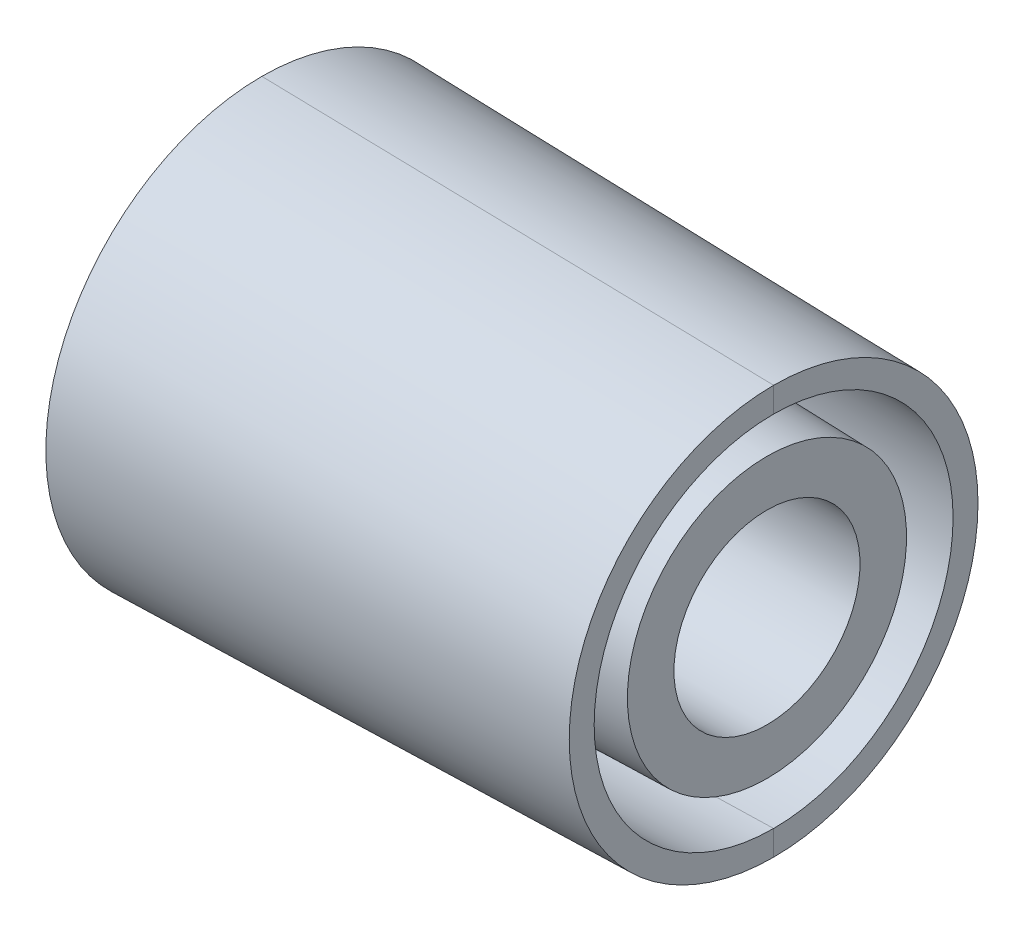
ISO-10303-21;
HEADER;
FILE_DESCRIPTION(('STEP AP214'),'2;1');
FILE_NAME('part.step','',(''),(''),'','','');
FILE_SCHEMA(('AUTOMOTIVE_DESIGN { 1 0 10303 214 1 1 1 1 }'));
ENDSEC;
DATA;
#1=APPLICATION_CONTEXT('core data for automotive mechanical design processes');
#2=APPLICATION_PROTOCOL_DEFINITION('international standard','automotive_design',2000,#1);
#3=PRODUCT_CONTEXT('',#1,'mechanical');
#4=PRODUCT('Part','Part','',(#3));
#5=PRODUCT_RELATED_PRODUCT_CATEGORY('part','',(#4));
#6=PRODUCT_DEFINITION_FORMATION('','',#4);
#7=PRODUCT_DEFINITION_CONTEXT('part definition',#1,'design');
#8=PRODUCT_DEFINITION('design','',#6,#7);
#9=PRODUCT_DEFINITION_SHAPE('','',#8);
#10=(LENGTH_UNIT() NAMED_UNIT(*) SI_UNIT(.MILLI.,.METRE.));
#11=(NAMED_UNIT(*) PLANE_ANGLE_UNIT() SI_UNIT($,.RADIAN.));
#12=(NAMED_UNIT(*) SI_UNIT($,.STERADIAN.) SOLID_ANGLE_UNIT());
#13=UNCERTAINTY_MEASURE_WITH_UNIT(LENGTH_MEASURE(1.E-05),#10,'distance_accuracy_value','');
#14=(GEOMETRIC_REPRESENTATION_CONTEXT(3) GLOBAL_UNCERTAINTY_ASSIGNED_CONTEXT((#13)) GLOBAL_UNIT_ASSIGNED_CONTEXT((#10,
#11,#12)) REPRESENTATION_CONTEXT('',''));
#15=CARTESIAN_POINT('',(0.,0.,0.));
#16=DIRECTION('',(0.,0.,1.));
#17=DIRECTION('',(1.,0.,0.));
#18=AXIS2_PLACEMENT_3D('',#15,#16,#17);
#19=CARTESIAN_POINT('',(3420.,0.,0.));
#20=DIRECTION('',(-1.,0.,0.));
#21=DIRECTION('',(0.,0.,1.));
#22=AXIS2_PLACEMENT_3D('',#19,#20,#21);
#23=CONICAL_SURFACE('',#22,540.,0.0259681872115557);
#24=CARTESIAN_POINT('',(1880.,0.,0.));
#25=DIRECTION('',(-1.,0.,0.));
#26=DIRECTION('',(0.,0.,1.));
#27=AXIS2_PLACEMENT_3D('',#24,#25,#26);
#28=CIRCLE('',#27,579.999999999999);
#29=CARTESIAN_POINT('',(1880.,579.999999999998,-3.10820800386331E-05));
#30=VERTEX_POINT('',#29);
#31=CARTESIAN_POINT('',(1880.,-579.999999999999,0.));
#32=VERTEX_POINT('',#31);
#33=EDGE_CURVE('E12',#30,#32,#28,.T.);
#34=ORIENTED_EDGE('',*,*,#33,.T.);
#35=DIRECTION('',(-0.999662845573694,-0.0259652687161992,0.));
#36=VECTOR('',#35,1.);
#37=CARTESIAN_POINT('',(3420.,-540.,0.));
#38=LINE('',#37,#36);
#39=CARTESIAN_POINT('',(3420.,-540.,0.));
#40=VERTEX_POINT('',#39);
#41=EDGE_CURVE('E89',#40,#32,#38,.T.);
#42=ORIENTED_EDGE('',*,*,#41,.F.);
#43=CARTESIAN_POINT('',(3420.,0.,0.));
#44=DIRECTION('',(-1.,0.,0.));
#45=DIRECTION('',(0.,0.,1.));
#46=AXIS2_PLACEMENT_3D('',#43,#44,#45);
#47=CIRCLE('',#46,540.);
#48=CARTESIAN_POINT('',(3420.,539.999999999999,-2.89384883118309E-05));
#49=VERTEX_POINT('',#48);
#50=EDGE_CURVE('E61',#49,#40,#47,.T.);
#51=ORIENTED_EDGE('',*,*,#50,.F.);
#52=DIRECTION('',(-0.999662845573694,0.0259652687161992,-1.39147338010607E-09));
#53=VECTOR('',#52,1.);
#54=CARTESIAN_POINT('',(3420.,539.999999999999,-2.89384883118309E-05));
#55=LINE('',#54,#53);
#56=EDGE_CURVE('E95',#49,#30,#55,.T.);
#57=ORIENTED_EDGE('',*,*,#56,.T.);
#58=EDGE_LOOP('',(#34,#42,#51,#57));
#59=FACE_BOUND('',#58,.T.);
#60=ADVANCED_FACE('F49',(#59),#23,.F.);
#61=CARTESIAN_POINT('',(1880.,579.999999999998,-3.10820800386331E-05));
#62=DIRECTION('',(-1.,0.,0.));
#63=DIRECTION('',(0.,0.,1.));
#64=AXIS2_PLACEMENT_3D('',#61,#62,#63);
#65=PLANE('',#64);
#66=CARTESIAN_POINT('',(1880.,0.,0.));
#67=DIRECTION('',(-1.,0.,0.));
#68=DIRECTION('',(0.,0.,1.));
#69=AXIS2_PLACEMENT_3D('',#66,#67,#68);
#70=CIRCLE('',#69,649.999999999999);
#71=CARTESIAN_POINT('',(1880.,649.999999999998,-3.48333655605372E-05));
#72=VERTEX_POINT('',#71);
#73=CARTESIAN_POINT('',(1880.,-649.999999999999,0.));
#74=VERTEX_POINT('',#73);
#75=EDGE_CURVE('E59',#72,#74,#70,.T.);
#76=ORIENTED_EDGE('',*,*,#75,.T.);
#77=DIRECTION('',(0.,-1.,0.));
#78=VECTOR('',#77,1.);
#79=CARTESIAN_POINT('',(1880.,-579.999999999999,0.));
#80=LINE('',#79,#78);
#81=EDGE_CURVE('E102',#32,#74,#80,.T.);
#82=ORIENTED_EDGE('',*,*,#81,.F.);
#83=ORIENTED_EDGE('',*,*,#33,.F.);
#84=DIRECTION('',(0.,0.999999999999999,-5.35897931700572E-08));
#85=VECTOR('',#84,1.);
#86=CARTESIAN_POINT('',(1880.,579.999999999998,-3.10820800386331E-05));
#87=LINE('',#86,#85);
#88=EDGE_CURVE('E112',#30,#72,#87,.T.);
#89=ORIENTED_EDGE('',*,*,#88,.T.);
#90=EDGE_LOOP('',(#76,#82,#83,#89));
#91=FACE_BOUND('',#90,.T.);
#92=ADVANCED_FACE('F55',(#91),#65,.T.);
#93=CARTESIAN_POINT('',(1880.,0.,0.));
#94=DIRECTION('',(-1.,0.,0.));
#95=DIRECTION('',(0.,0.,1.));
#96=AXIS2_PLACEMENT_3D('',#93,#94,#95);
#97=CONICAL_SURFACE('',#96,649.999999999999,0.0227233608416411);
#98=CARTESIAN_POINT('',(3420.,0.,0.));
#99=DIRECTION('',(-1.,0.,0.));
#100=DIRECTION('',(0.,0.,1.));
#101=AXIS2_PLACEMENT_3D('',#98,#99,#100);
#102=CIRCLE('',#101,614.999999999999);
#103=CARTESIAN_POINT('',(3420.,614.999999999998,-3.29577227995852E-05));
#104=VERTEX_POINT('',#103);
#105=CARTESIAN_POINT('',(3420.,-614.999999999999,0.));
#106=VERTEX_POINT('',#105);
#107=EDGE_CURVE('E73',#104,#106,#102,.T.);
#108=ORIENTED_EDGE('',*,*,#107,.T.);
#109=DIRECTION('',(0.999741835544943,0.0227214053532942,0.));
#110=VECTOR('',#109,1.);
#111=CARTESIAN_POINT('',(1880.,-649.999999999999,0.));
#112=LINE('',#111,#110);
#113=EDGE_CURVE('E103',#74,#106,#112,.T.);
#114=ORIENTED_EDGE('',*,*,#113,.F.);
#115=ORIENTED_EDGE('',*,*,#75,.F.);
#116=DIRECTION('',(0.999741835544943,-0.0227214053532941,1.21763541341607E-09));
#117=VECTOR('',#116,1.);
#118=CARTESIAN_POINT('',(1880.,649.999999999998,-3.48333655605372E-05));
#119=LINE('',#118,#117);
#120=EDGE_CURVE('E111',#72,#104,#119,.T.);
#121=ORIENTED_EDGE('',*,*,#120,.T.);
#122=EDGE_LOOP('',(#108,#114,#115,#121));
#123=FACE_BOUND('',#122,.T.);
#124=ADVANCED_FACE('F119',(#123),#97,.T.);
#125=CARTESIAN_POINT('',(3420.,614.999999999998,-3.29577227995852E-05));
#126=DIRECTION('',(1.,0.,0.));
#127=DIRECTION('',(0.,0.,-1.));
#128=AXIS2_PLACEMENT_3D('',#125,#126,#127);
#129=PLANE('',#128);
#130=DIRECTION('',(0.,-0.999999999999999,5.35897931700572E-08));
#131=VECTOR('',#130,1.);
#132=CARTESIAN_POINT('',(3420.,614.999999999998,-3.29577227995852E-05));
#133=LINE('',#132,#131);
#134=EDGE_CURVE('E113',#104,#49,#133,.T.);
#135=ORIENTED_EDGE('',*,*,#134,.T.);
#136=ORIENTED_EDGE('',*,*,#50,.T.);
#137=DIRECTION('',(0.,1.,0.));
#138=VECTOR('',#137,1.);
#139=CARTESIAN_POINT('',(3420.,-614.999999999999,0.));
#140=LINE('',#139,#138);
#141=EDGE_CURVE('E104',#106,#40,#140,.T.);
#142=ORIENTED_EDGE('',*,*,#141,.F.);
#143=ORIENTED_EDGE('',*,*,#107,.F.);
#144=EDGE_LOOP('',(#135,#136,#142,#143));
#145=FACE_BOUND('',#144,.T.);
#146=ADVANCED_FACE('F122',(#145),#129,.T.);
#147=CARTESIAN_POINT('',(0.,0.,0.));
#148=DIRECTION('',(0.,-5.35897931700572E-08,-0.999999999999999));
#149=DIRECTION('',(1.,0.,0.));
#150=AXIS2_PLACEMENT_3D('',#147,#148,#149);
#151=PLANE('',#150);
#152=ORIENTED_EDGE('',*,*,#56,.F.);
#153=ORIENTED_EDGE('',*,*,#134,.F.);
#154=ORIENTED_EDGE('',*,*,#120,.F.);
#155=ORIENTED_EDGE('',*,*,#88,.F.);
#156=EDGE_LOOP('',(#152,#153,#154,#155));
#157=FACE_BOUND('',#156,.T.);
#158=ADVANCED_FACE('F125',(#157),#151,.F.);
#159=CARTESIAN_POINT('',(0.,0.,0.));
#160=DIRECTION('',(0.,0.,1.));
#161=DIRECTION('',(1.,0.,0.));
#162=AXIS2_PLACEMENT_3D('',#159,#160,#161);
#163=PLANE('',#162);
#164=ORIENTED_EDGE('',*,*,#41,.T.);
#165=ORIENTED_EDGE('',*,*,#81,.T.);
#166=ORIENTED_EDGE('',*,*,#113,.T.);
#167=ORIENTED_EDGE('',*,*,#141,.T.);
#168=EDGE_LOOP('',(#164,#165,#166,#167));
#169=FACE_BOUND('',#168,.T.);
#170=ADVANCED_FACE('F98',(#169),#163,.T.);
#171=CLOSED_SHELL('',(#60,#92,#124,#146,#158,#170));
#172=MANIFOLD_SOLID_BREP('B2',#171);
#173=CARTESIAN_POINT('',(1880.,0.,0.));
#174=DIRECTION('',(-1.,0.,0.));
#175=DIRECTION('',(0.,0.,1.));
#176=AXIS2_PLACEMENT_3D('',#173,#174,#175);
#177=CONICAL_SURFACE('',#176,580.,0.0259681872115563);
#178=CARTESIAN_POINT('',(1880.,0.,0.));
#179=DIRECTION('',(-1.,0.,0.));
#180=DIRECTION('',(0.,0.,1.));
#181=AXIS2_PLACEMENT_3D('',#178,#179,#180);
#182=CIRCLE('',#181,580.);
#183=CARTESIAN_POINT('',(1880.,-579.999999999999,3.10820800386332E-05));
#184=VERTEX_POINT('',#183);
#185=CARTESIAN_POINT('',(1880.,580.,0.));
#186=VERTEX_POINT('',#185);
#187=EDGE_CURVE('E48',#184,#186,#182,.T.);
#188=ORIENTED_EDGE('',*,*,#187,.T.);
#189=DIRECTION('',(0.999662845573694,-0.0259652687161998,0.));
#190=VECTOR('',#189,1.);
#191=CARTESIAN_POINT('',(3420.,540.,0.));
#192=LINE('',#191,#190);
#193=CARTESIAN_POINT('',(3420.,540.,0.));
#194=VERTEX_POINT('',#193);
#195=EDGE_CURVE('E242',#186,#194,#192,.T.);
#196=ORIENTED_EDGE('',*,*,#195,.T.);
#197=CARTESIAN_POINT('',(3420.,0.,0.));
#198=DIRECTION('',(-1.,0.,0.));
#199=DIRECTION('',(0.,0.,1.));
#200=AXIS2_PLACEMENT_3D('',#197,#198,#199);
#201=CIRCLE('',#200,540.);
#202=CARTESIAN_POINT('',(3420.,-539.999999999999,2.89384883118309E-05));
#203=VERTEX_POINT('',#202);
#204=EDGE_CURVE('E223',#203,#194,#201,.T.);
#205=ORIENTED_EDGE('',*,*,#204,.F.);
#206=DIRECTION('',(0.999662845573694,0.0259652687161998,-1.39147338010611E-09));
#207=VECTOR('',#206,1.);
#208=CARTESIAN_POINT('',(3420.,-539.999999999999,2.89384883118309E-05));
#209=LINE('',#208,#207);
#210=EDGE_CURVE('E249',#184,#203,#209,.T.);
#211=ORIENTED_EDGE('',*,*,#210,.F.);
#212=EDGE_LOOP('',(#188,#196,#205,#211));
#213=FACE_BOUND('',#212,.T.);
#214=ADVANCED_FACE('F183',(#213),#177,.F.);
#215=CARTESIAN_POINT('',(1880.,-579.999999999999,3.10820800386332E-05));
#216=DIRECTION('',(1.,0.,0.));
#217=DIRECTION('',(0.,0.,-1.));
#218=AXIS2_PLACEMENT_3D('',#215,#216,#217);
#219=PLANE('',#218);
#220=CARTESIAN_POINT('',(1880.,0.,0.));
#221=DIRECTION('',(-1.,0.,0.));
#222=DIRECTION('',(0.,0.,1.));
#223=AXIS2_PLACEMENT_3D('',#220,#221,#222);
#224=CIRCLE('',#223,650.);
#225=CARTESIAN_POINT('',(1880.,-649.999999999999,3.48333655605372E-05));
#226=VERTEX_POINT('',#225);
#227=CARTESIAN_POINT('',(1880.,650.,0.));
#228=VERTEX_POINT('',#227);
#229=EDGE_CURVE('E192',#226,#228,#224,.T.);
#230=ORIENTED_EDGE('',*,*,#229,.T.);
#231=DIRECTION('',(0.,-1.,0.));
#232=VECTOR('',#231,1.);
#233=CARTESIAN_POINT('',(1880.,580.,0.));
#234=LINE('',#233,#232);
#235=EDGE_CURVE('E250',#228,#186,#234,.T.);
#236=ORIENTED_EDGE('',*,*,#235,.T.);
#237=ORIENTED_EDGE('',*,*,#187,.F.);
#238=DIRECTION('',(0.,0.999999999999999,-5.35897931700572E-08));
#239=VECTOR('',#238,1.);
#240=CARTESIAN_POINT('',(1880.,-579.999999999999,3.10820800386332E-05));
#241=LINE('',#240,#239);
#242=EDGE_CURVE('E234',#226,#184,#241,.T.);
#243=ORIENTED_EDGE('',*,*,#242,.F.);
#244=EDGE_LOOP('',(#230,#236,#237,#243));
#245=FACE_BOUND('',#244,.T.);
#246=ADVANCED_FACE('F184',(#245),#219,.F.);
#247=CARTESIAN_POINT('',(3420.,0.,0.));
#248=DIRECTION('',(-1.,0.,0.));
#249=DIRECTION('',(0.,0.,1.));
#250=AXIS2_PLACEMENT_3D('',#247,#248,#249);
#251=CONICAL_SURFACE('',#250,615.,0.0227233608416411);
#252=CARTESIAN_POINT('',(3420.,0.,0.));
#253=DIRECTION('',(-1.,0.,0.));
#254=DIRECTION('',(0.,0.,1.));
#255=AXIS2_PLACEMENT_3D('',#252,#253,#254);
#256=CIRCLE('',#255,615.);
#257=CARTESIAN_POINT('',(3420.,-614.999999999999,3.29577227995852E-05));
#258=VERTEX_POINT('',#257);
#259=CARTESIAN_POINT('',(3420.,615.,0.));
#260=VERTEX_POINT('',#259);
#261=EDGE_CURVE('E233',#258,#260,#256,.T.);
#262=ORIENTED_EDGE('',*,*,#261,.T.);
#263=DIRECTION('',(-0.999741835544943,0.0227214053532942,0.));
#264=VECTOR('',#263,1.);
#265=CARTESIAN_POINT('',(1880.,650.,0.));
#266=LINE('',#265,#264);
#267=EDGE_CURVE('E245',#260,#228,#266,.T.);
#268=ORIENTED_EDGE('',*,*,#267,.T.);
#269=ORIENTED_EDGE('',*,*,#229,.F.);
#270=DIRECTION('',(-0.999741835544943,-0.0227214053532941,1.21763541341607E-09));
#271=VECTOR('',#270,1.);
#272=CARTESIAN_POINT('',(1880.,-649.999999999999,3.48333655605372E-05));
#273=LINE('',#272,#271);
#274=EDGE_CURVE('E255',#258,#226,#273,.T.);
#275=ORIENTED_EDGE('',*,*,#274,.F.);
#276=EDGE_LOOP('',(#262,#268,#269,#275));
#277=FACE_BOUND('',#276,.T.);
#278=ADVANCED_FACE('F251',(#277),#251,.T.);
#279=CARTESIAN_POINT('',(3420.,-614.999999999999,3.29577227995852E-05));
#280=DIRECTION('',(-1.,0.,0.));
#281=DIRECTION('',(0.,0.,1.));
#282=AXIS2_PLACEMENT_3D('',#279,#280,#281);
#283=PLANE('',#282);
#284=DIRECTION('',(0.,-0.999999999999999,5.35897931700572E-08));
#285=VECTOR('',#284,1.);
#286=CARTESIAN_POINT('',(3420.,-614.999999999999,3.29577227995852E-05));
#287=LINE('',#286,#285);
#288=EDGE_CURVE('E227',#203,#258,#287,.T.);
#289=ORIENTED_EDGE('',*,*,#288,.F.);
#290=ORIENTED_EDGE('',*,*,#204,.T.);
#291=DIRECTION('',(0.,1.,0.));
#292=VECTOR('',#291,1.);
#293=CARTESIAN_POINT('',(3420.,615.,0.));
#294=LINE('',#293,#292);
#295=EDGE_CURVE('E226',#194,#260,#294,.T.);
#296=ORIENTED_EDGE('',*,*,#295,.T.);
#297=ORIENTED_EDGE('',*,*,#261,.F.);
#298=EDGE_LOOP('',(#289,#290,#296,#297));
#299=FACE_BOUND('',#298,.T.);
#300=ADVANCED_FACE('F224',(#299),#283,.F.);
#301=CARTESIAN_POINT('',(0.,0.,0.));
#302=DIRECTION('',(0.,5.35897931700572E-08,0.999999999999999));
#303=DIRECTION('',(-1.,0.,0.));
#304=AXIS2_PLACEMENT_3D('',#301,#302,#303);
#305=PLANE('',#304);
#306=ORIENTED_EDGE('',*,*,#210,.T.);
#307=ORIENTED_EDGE('',*,*,#288,.T.);
#308=ORIENTED_EDGE('',*,*,#274,.T.);
#309=ORIENTED_EDGE('',*,*,#242,.T.);
#310=EDGE_LOOP('',(#306,#307,#308,#309));
#311=FACE_BOUND('',#310,.T.);
#312=ADVANCED_FACE('F257',(#311),#305,.F.);
#313=CARTESIAN_POINT('',(0.,0.,0.));
#314=DIRECTION('',(0.,0.,-1.));
#315=DIRECTION('',(-1.,0.,0.));
#316=AXIS2_PLACEMENT_3D('',#313,#314,#315);
#317=PLANE('',#316);
#318=ORIENTED_EDGE('',*,*,#195,.F.);
#319=ORIENTED_EDGE('',*,*,#235,.F.);
#320=ORIENTED_EDGE('',*,*,#267,.F.);
#321=ORIENTED_EDGE('',*,*,#295,.F.);
#322=EDGE_LOOP('',(#318,#319,#320,#321));
#323=FACE_BOUND('',#322,.T.);
#324=ADVANCED_FACE('F236',(#323),#317,.T.);
#325=CLOSED_SHELL('',(#214,#246,#278,#300,#312,#324));
#326=MANIFOLD_SOLID_BREP('B6',#325);
#327=CARTESIAN_POINT('',(0.,0.,0.));
#328=DIRECTION('',(-1.,0.,0.));
#329=DIRECTION('',(0.,0.,1.));
#330=AXIS2_PLACEMENT_3D('',#327,#328,#329);
#331=CYLINDRICAL_SURFACE('',#330,280.);
#332=CARTESIAN_POINT('',(1900.,0.,0.));
#333=DIRECTION('',(-1.,0.,0.));
#334=DIRECTION('',(0.,0.,1.));
#335=AXIS2_PLACEMENT_3D('',#332,#333,#334);
#336=CIRCLE('',#335,280.);
#337=CARTESIAN_POINT('',(1900.,280.,-2.0102840967113E-06));
#338=VERTEX_POINT('',#337);
#339=CARTESIAN_POINT('',(1900.,280.,0.));
#340=VERTEX_POINT('',#339);
#341=EDGE_CURVE('E181',#338,#340,#336,.T.);
#342=ORIENTED_EDGE('',*,*,#341,.T.);
#343=DIRECTION('',(1.,0.,0.));
#344=VECTOR('',#343,1.);
#345=CARTESIAN_POINT('',(3400.,280.,0.));
#346=LINE('',#345,#344);
#347=CARTESIAN_POINT('',(3400.,280.,0.));
#348=VERTEX_POINT('',#347);
#349=EDGE_CURVE('E364',#340,#348,#346,.T.);
#350=ORIENTED_EDGE('',*,*,#349,.T.);
#351=CARTESIAN_POINT('',(3400.,0.,0.));
#352=DIRECTION('',(-1.,0.,0.));
#353=DIRECTION('',(0.,0.,1.));
#354=AXIS2_PLACEMENT_3D('',#351,#352,#353);
#355=CIRCLE('',#354,280.);
#356=CARTESIAN_POINT('',(3400.,280.,-2.0102840967113E-06));
#357=VERTEX_POINT('',#356);
#358=EDGE_CURVE('E347',#357,#348,#355,.T.);
#359=ORIENTED_EDGE('',*,*,#358,.F.);
#360=DIRECTION('',(1.,0.,0.));
#361=VECTOR('',#360,1.);
#362=CARTESIAN_POINT('',(3400.,280.,-2.0102840967113E-06));
#363=LINE('',#362,#361);
#364=EDGE_CURVE('E374',#338,#357,#363,.T.);
#365=ORIENTED_EDGE('',*,*,#364,.F.);
#366=EDGE_LOOP('',(#342,#350,#359,#365));
#367=FACE_BOUND('',#366,.T.);
#368=ADVANCED_FACE('F310',(#367),#331,.F.);
#369=CARTESIAN_POINT('',(1900.,280.,-2.0102840967113E-06));
#370=DIRECTION('',(1.,0.,0.));
#371=DIRECTION('',(0.,0.,-1.));
#372=AXIS2_PLACEMENT_3D('',#369,#370,#371);
#373=PLANE('',#372);
#374=CARTESIAN_POINT('',(1900.,0.,0.));
#375=DIRECTION('',(-1.,0.,0.));
#376=DIRECTION('',(0.,0.,1.));
#377=AXIS2_PLACEMENT_3D('',#374,#375,#376);
#378=CIRCLE('',#377,460.);
#379=CARTESIAN_POINT('',(1900.,460.,-3.30260958745428E-06));
#380=VERTEX_POINT('',#379);
#381=CARTESIAN_POINT('',(1900.,460.,0.));
#382=VERTEX_POINT('',#381);
#383=EDGE_CURVE('E314',#380,#382,#378,.T.);
#384=ORIENTED_EDGE('',*,*,#383,.T.);
#385=DIRECTION('',(0.,-1.,0.));
#386=VECTOR('',#385,1.);
#387=CARTESIAN_POINT('',(1900.,280.,0.));
#388=LINE('',#387,#386);
#389=EDGE_CURVE('E372',#382,#340,#388,.T.);
#390=ORIENTED_EDGE('',*,*,#389,.T.);
#391=ORIENTED_EDGE('',*,*,#341,.F.);
#392=DIRECTION('',(0.,-1.,7.17958605968322E-09));
#393=VECTOR('',#392,1.);
#394=CARTESIAN_POINT('',(1900.,280.,-2.0102840967113E-06));
#395=LINE('',#394,#393);
#396=EDGE_CURVE('E357',#380,#338,#395,.T.);
#397=ORIENTED_EDGE('',*,*,#396,.F.);
#398=EDGE_LOOP('',(#384,#390,#391,#397));
#399=FACE_BOUND('',#398,.T.);
#400=ADVANCED_FACE('F309',(#399),#373,.F.);
#401=CARTESIAN_POINT('',(3400.,0.,0.));
#402=DIRECTION('',(-1.,0.,0.));
#403=DIRECTION('',(0.,0.,1.));
#404=AXIS2_PLACEMENT_3D('',#401,#402,#403);
#405=CONICAL_SURFACE('',#404,420.,0.026660348374598);
#406=CARTESIAN_POINT('',(3400.,0.,0.));
#407=DIRECTION('',(-1.,0.,0.));
#408=DIRECTION('',(0.,0.,1.));
#409=AXIS2_PLACEMENT_3D('',#406,#407,#408);
#410=CIRCLE('',#409,420.);
#411=CARTESIAN_POINT('',(3400.,420.,-3.01542614506695E-06));
#412=VERTEX_POINT('',#411);
#413=CARTESIAN_POINT('',(3400.,420.,0.));
#414=VERTEX_POINT('',#413);
#415=EDGE_CURVE('E358',#412,#414,#410,.T.);
#416=ORIENTED_EDGE('',*,*,#415,.T.);
#417=DIRECTION('',(-0.999644633961771,0.0266571902389806,0.));
#418=VECTOR('',#417,1.);
#419=CARTESIAN_POINT('',(1900.,460.,0.));
#420=LINE('',#419,#418);
#421=EDGE_CURVE('E366',#414,#382,#420,.T.);
#422=ORIENTED_EDGE('',*,*,#421,.T.);
#423=ORIENTED_EDGE('',*,*,#383,.F.);
#424=DIRECTION('',(-0.999644633961771,0.0266571902389806,-1.91387591430109E-10));
#425=VECTOR('',#424,1.);
#426=CARTESIAN_POINT('',(1900.,460.,-3.30260958745428E-06));
#427=LINE('',#426,#425);
#428=EDGE_CURVE('E377',#412,#380,#427,.T.);
#429=ORIENTED_EDGE('',*,*,#428,.F.);
#430=EDGE_LOOP('',(#416,#422,#423,#429));
#431=FACE_BOUND('',#430,.T.);
#432=ADVANCED_FACE('F379',(#431),#405,.T.);
#433=CARTESIAN_POINT('',(3400.,420.,-3.01542614506695E-06));
#434=DIRECTION('',(-1.,0.,0.));
#435=DIRECTION('',(0.,0.,1.));
#436=AXIS2_PLACEMENT_3D('',#433,#434,#435);
#437=PLANE('',#436);
#438=DIRECTION('',(0.,1.,-7.17958605968322E-09));
#439=VECTOR('',#438,1.);
#440=CARTESIAN_POINT('',(3400.,420.,-3.01542614506695E-06));
#441=LINE('',#440,#439);
#442=EDGE_CURVE('E351',#357,#412,#441,.T.);
#443=ORIENTED_EDGE('',*,*,#442,.F.);
#444=ORIENTED_EDGE('',*,*,#358,.T.);
#445=DIRECTION('',(0.,1.,0.));
#446=VECTOR('',#445,1.);
#447=CARTESIAN_POINT('',(3400.,420.,0.));
#448=LINE('',#447,#446);
#449=EDGE_CURVE('E349',#348,#414,#448,.T.);
#450=ORIENTED_EDGE('',*,*,#449,.T.);
#451=ORIENTED_EDGE('',*,*,#415,.F.);
#452=EDGE_LOOP('',(#443,#444,#450,#451));
#453=FACE_BOUND('',#452,.T.);
#454=ADVANCED_FACE('F350',(#453),#437,.F.);
#455=CARTESIAN_POINT('',(0.,0.,0.));
#456=DIRECTION('',(0.,-7.17958605968322E-09,-1.));
#457=DIRECTION('',(-1.,0.,0.));
#458=AXIS2_PLACEMENT_3D('',#455,#456,#457);
#459=PLANE('',#458);
#460=ORIENTED_EDGE('',*,*,#364,.T.);
#461=ORIENTED_EDGE('',*,*,#442,.T.);
#462=ORIENTED_EDGE('',*,*,#428,.T.);
#463=ORIENTED_EDGE('',*,*,#396,.T.);
#464=EDGE_LOOP('',(#460,#461,#462,#463));
#465=FACE_BOUND('',#464,.T.);
#466=ADVANCED_FACE('F382',(#465),#459,.F.);
#467=CARTESIAN_POINT('',(0.,0.,0.));
#468=DIRECTION('',(0.,0.,-1.));
#469=DIRECTION('',(-1.,0.,0.));
#470=AXIS2_PLACEMENT_3D('',#467,#468,#469);
#471=PLANE('',#470);
#472=ORIENTED_EDGE('',*,*,#349,.F.);
#473=ORIENTED_EDGE('',*,*,#389,.F.);
#474=ORIENTED_EDGE('',*,*,#421,.F.);
#475=ORIENTED_EDGE('',*,*,#449,.F.);
#476=EDGE_LOOP('',(#472,#473,#474,#475));
#477=FACE_BOUND('',#476,.T.);
#478=ADVANCED_FACE('F363',(#477),#471,.T.);
#479=CLOSED_SHELL('',(#368,#400,#432,#454,#466,#478));
#480=MANIFOLD_SOLID_BREP('B45',#479);
#481=ADVANCED_BREP_SHAPE_REPRESENTATION('',(#18,#172,#326,#480),#14);
#482=SHAPE_DEFINITION_REPRESENTATION(#9,#481);
ENDSEC;
END-ISO-10303-21;
